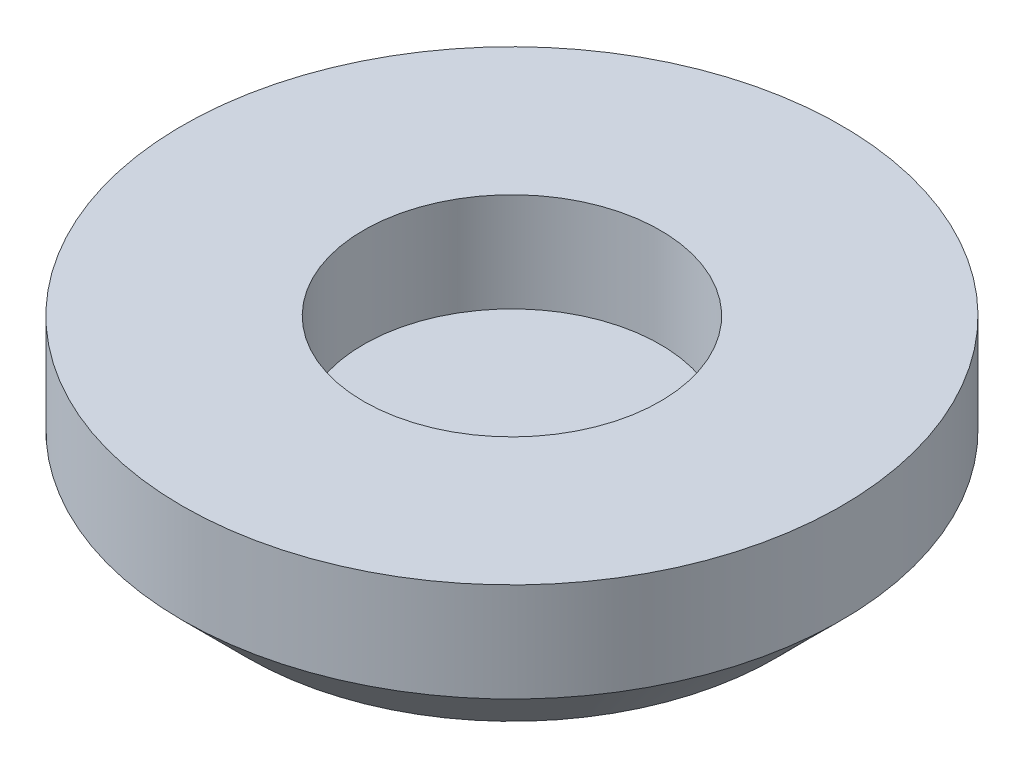
ISO-10303-21;
HEADER;
FILE_DESCRIPTION(('STEP AP214'),'2;1');
FILE_NAME('part.step','',(''),(''),'','','');
FILE_SCHEMA(('AUTOMOTIVE_DESIGN { 1 0 10303 214 1 1 1 1 }'));
ENDSEC;
DATA;
#1=APPLICATION_CONTEXT('core data for automotive mechanical design processes');
#2=APPLICATION_PROTOCOL_DEFINITION('international standard','automotive_design',2000,#1);
#3=PRODUCT_CONTEXT('',#1,'mechanical');
#4=PRODUCT('Part','Part','',(#3));
#5=PRODUCT_RELATED_PRODUCT_CATEGORY('part','',(#4));
#6=PRODUCT_DEFINITION_FORMATION('','',#4);
#7=PRODUCT_DEFINITION_CONTEXT('part definition',#1,'design');
#8=PRODUCT_DEFINITION('design','',#6,#7);
#9=PRODUCT_DEFINITION_SHAPE('','',#8);
#10=(LENGTH_UNIT() NAMED_UNIT(*) SI_UNIT(.MILLI.,.METRE.));
#11=(NAMED_UNIT(*) PLANE_ANGLE_UNIT() SI_UNIT($,.RADIAN.));
#12=(NAMED_UNIT(*) SI_UNIT($,.STERADIAN.) SOLID_ANGLE_UNIT());
#13=UNCERTAINTY_MEASURE_WITH_UNIT(LENGTH_MEASURE(1.E-05),#10,'distance_accuracy_value','');
#14=(GEOMETRIC_REPRESENTATION_CONTEXT(3) GLOBAL_UNCERTAINTY_ASSIGNED_CONTEXT((#13)) GLOBAL_UNIT_ASSIGNED_CONTEXT((#10,
#11,#12)) REPRESENTATION_CONTEXT('',''));
#15=CARTESIAN_POINT('',(0.,0.,0.));
#16=DIRECTION('',(0.,0.,1.));
#17=DIRECTION('',(1.,0.,0.));
#18=AXIS2_PLACEMENT_3D('',#15,#16,#17);
#19=CARTESIAN_POINT('',(0.,5.,0.));
#20=DIRECTION('',(0.,-1.,0.));
#21=DIRECTION('',(0.,0.,-1.));
#22=AXIS2_PLACEMENT_3D('',#19,#20,#21);
#23=CYLINDRICAL_SURFACE('',#22,10.);
#24=CARTESIAN_POINT('',(0.,2.,0.));
#25=DIRECTION('',(0.,1.,0.));
#26=DIRECTION('',(0.,0.,1.));
#27=AXIS2_PLACEMENT_3D('',#24,#25,#26);
#28=CIRCLE('',#27,10.);
#29=CARTESIAN_POINT('',(0.,2.,10.));
#30=VERTEX_POINT('',#29);
#31=EDGE_CURVE('E45',#30,#30,#28,.T.);
#32=ORIENTED_EDGE('',*,*,#31,.T.);
#33=EDGE_LOOP('',(#32));
#34=FACE_BOUND('',#33,.T.);
#35=CARTESIAN_POINT('',(0.,5.,0.));
#36=DIRECTION('',(0.,1.,0.));
#37=DIRECTION('',(0.,0.,1.));
#38=AXIS2_PLACEMENT_3D('',#35,#36,#37);
#39=CIRCLE('',#38,10.);
#40=CARTESIAN_POINT('',(0.,5.,10.));
#41=VERTEX_POINT('',#40);
#42=EDGE_CURVE('E50',#41,#41,#39,.T.);
#43=ORIENTED_EDGE('',*,*,#42,.F.);
#44=EDGE_LOOP('',(#43));
#45=FACE_BOUND('',#44,.T.);
#46=ADVANCED_FACE('F37',(#34,#45),#23,.T.);
#47=CARTESIAN_POINT('',(0.,5.,0.));
#48=DIRECTION('',(0.,1.,0.));
#49=DIRECTION('',(0.,0.,1.));
#50=AXIS2_PLACEMENT_3D('',#47,#48,#49);
#51=PLANE('',#50);
#52=CARTESIAN_POINT('',(0.,5.,0.));
#53=DIRECTION('',(0.,1.,0.));
#54=DIRECTION('',(0.,0.,1.));
#55=AXIS2_PLACEMENT_3D('',#52,#53,#54);
#56=CIRCLE('',#55,4.5);
#57=CARTESIAN_POINT('',(0.,5.,4.5));
#58=VERTEX_POINT('',#57);
#59=EDGE_CURVE('E58',#58,#58,#56,.T.);
#60=ORIENTED_EDGE('',*,*,#59,.F.);
#61=EDGE_LOOP('',(#60));
#62=FACE_BOUND('',#61,.T.);
#63=ORIENTED_EDGE('',*,*,#42,.T.);
#64=EDGE_LOOP('',(#63));
#65=FACE_BOUND('',#64,.T.);
#66=ADVANCED_FACE('F75',(#62,#65),#51,.T.);
#67=CARTESIAN_POINT('',(0.,0.,0.));
#68=DIRECTION('',(0.,1.,0.));
#69=DIRECTION('',(0.,0.,1.));
#70=AXIS2_PLACEMENT_3D('',#67,#68,#69);
#71=PLANE('',#70);
#72=CARTESIAN_POINT('',(0.,0.,0.));
#73=DIRECTION('',(0.,1.,0.));
#74=DIRECTION('',(0.,0.,1.));
#75=AXIS2_PLACEMENT_3D('',#72,#73,#74);
#76=CIRCLE('',#75,7.99999999999999);
#77=CARTESIAN_POINT('',(0.,0.,7.99999999999999));
#78=VERTEX_POINT('',#77);
#79=EDGE_CURVE('E10',#78,#78,#76,.F.);
#80=ORIENTED_EDGE('',*,*,#79,.T.);
#81=EDGE_LOOP('',(#80));
#82=FACE_BOUND('',#81,.T.);
#83=ADVANCED_FACE('F71',(#82),#71,.F.);
#84=CARTESIAN_POINT('',(0.,2.,0.));
#85=DIRECTION('',(0.,1.,0.));
#86=DIRECTION('',(0.,0.,1.));
#87=AXIS2_PLACEMENT_3D('',#84,#85,#86);
#88=CYLINDRICAL_SURFACE('',#87,4.5);
#89=CARTESIAN_POINT('',(0.,2.,0.));
#90=DIRECTION('',(0.,1.,0.));
#91=DIRECTION('',(0.,0.,1.));
#92=AXIS2_PLACEMENT_3D('',#89,#90,#91);
#93=CIRCLE('',#92,4.5);
#94=CARTESIAN_POINT('',(0.,2.,4.5));
#95=VERTEX_POINT('',#94);
#96=EDGE_CURVE('E55',#95,#95,#93,.T.);
#97=ORIENTED_EDGE('',*,*,#96,.F.);
#98=EDGE_LOOP('',(#97));
#99=FACE_BOUND('',#98,.T.);
#100=ORIENTED_EDGE('',*,*,#59,.T.);
#101=EDGE_LOOP('',(#100));
#102=FACE_BOUND('',#101,.T.);
#103=ADVANCED_FACE('F68',(#99,#102),#88,.F.);
#104=CARTESIAN_POINT('',(0.,2.,0.));
#105=DIRECTION('',(0.,1.,0.));
#106=DIRECTION('',(0.,0.,1.));
#107=AXIS2_PLACEMENT_3D('',#104,#105,#106);
#108=PLANE('',#107);
#109=ORIENTED_EDGE('',*,*,#96,.T.);
#110=EDGE_LOOP('',(#109));
#111=FACE_BOUND('',#110,.T.);
#112=ADVANCED_FACE('F66',(#111),#108,.T.);
#113=CARTESIAN_POINT('',(0.,2.,0.));
#114=DIRECTION('',(0.,1.,0.));
#115=DIRECTION('',(0.,0.,1.));
#116=AXIS2_PLACEMENT_3D('',#113,#114,#115);
#117=CONICAL_SURFACE('',#116,10.,0.78539816339745);
#118=ORIENTED_EDGE('',*,*,#79,.F.);
#119=EDGE_LOOP('',(#118));
#120=FACE_BOUND('',#119,.T.);
#121=ORIENTED_EDGE('',*,*,#31,.F.);
#122=EDGE_LOOP('',(#121));
#123=FACE_BOUND('',#122,.T.);
#124=ADVANCED_FACE('F39',(#120,#123),#117,.T.);
#125=CLOSED_SHELL('',(#46,#66,#83,#103,#112,#124));
#126=MANIFOLD_SOLID_BREP('B2',#125);
#127=ADVANCED_BREP_SHAPE_REPRESENTATION('',(#18,#126),#14);
#128=SHAPE_DEFINITION_REPRESENTATION(#9,#127);
ENDSEC;
END-ISO-10303-21;
